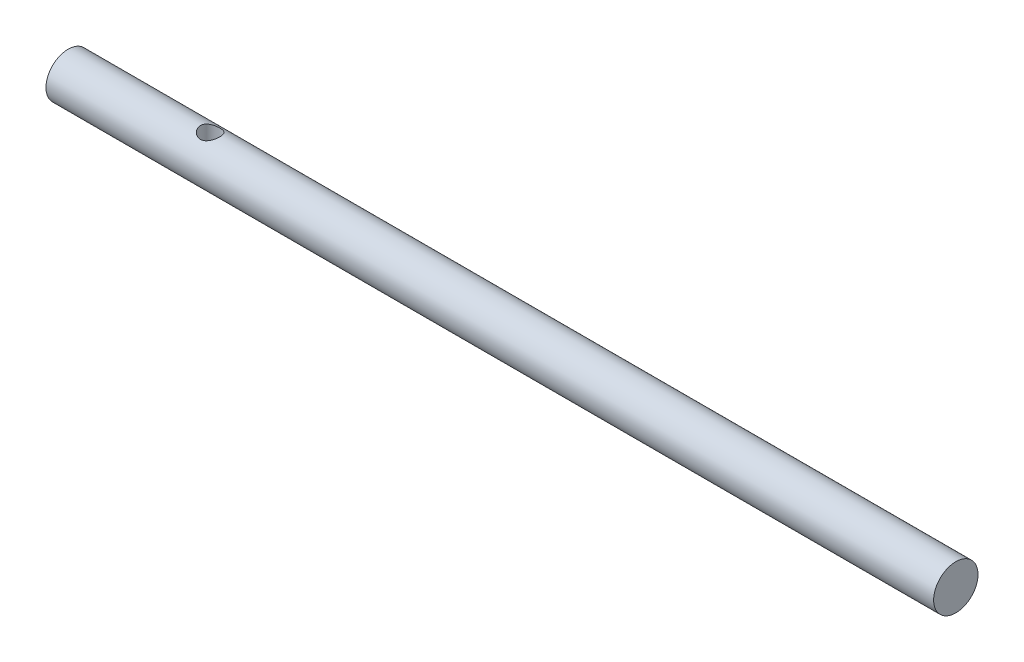
ISO-10303-21;
HEADER;
FILE_DESCRIPTION(('STEP AP214'),'2;1');
FILE_NAME('part.step','',(''),(''),'','','');
FILE_SCHEMA(('AUTOMOTIVE_DESIGN { 1 0 10303 214 1 1 1 1 }'));
ENDSEC;
DATA;
#1=APPLICATION_CONTEXT('core data for automotive mechanical design processes');
#2=APPLICATION_PROTOCOL_DEFINITION('international standard','automotive_design',2000,#1);
#3=PRODUCT_CONTEXT('',#1,'mechanical');
#4=PRODUCT('Part','Part','',(#3));
#5=PRODUCT_RELATED_PRODUCT_CATEGORY('part','',(#4));
#6=PRODUCT_DEFINITION_FORMATION('','',#4);
#7=PRODUCT_DEFINITION_CONTEXT('part definition',#1,'design');
#8=PRODUCT_DEFINITION('design','',#6,#7);
#9=PRODUCT_DEFINITION_SHAPE('','',#8);
#10=(LENGTH_UNIT() NAMED_UNIT(*) SI_UNIT(.MILLI.,.METRE.));
#11=(NAMED_UNIT(*) PLANE_ANGLE_UNIT() SI_UNIT($,.RADIAN.));
#12=(NAMED_UNIT(*) SI_UNIT($,.STERADIAN.) SOLID_ANGLE_UNIT());
#13=UNCERTAINTY_MEASURE_WITH_UNIT(LENGTH_MEASURE(1.E-05),#10,'distance_accuracy_value','');
#14=(GEOMETRIC_REPRESENTATION_CONTEXT(3) GLOBAL_UNCERTAINTY_ASSIGNED_CONTEXT((#13)) GLOBAL_UNIT_ASSIGNED_CONTEXT((#10,
#11,#12)) REPRESENTATION_CONTEXT('',''));
#15=CARTESIAN_POINT('',(0.,0.,0.));
#16=DIRECTION('',(0.,0.,1.));
#17=DIRECTION('',(1.,0.,0.));
#18=AXIS2_PLACEMENT_3D('',#15,#16,#17);
#19=CARTESIAN_POINT('',(50.,0.,0.));
#20=DIRECTION('',(-1.,0.,0.));
#21=DIRECTION('',(0.,0.,1.));
#22=AXIS2_PLACEMENT_3D('',#19,#20,#21);
#23=CYLINDRICAL_SURFACE('',#22,2.5);
#24=CARTESIAN_POINT('',(-34.,-2.24499443206436,1.1));
#25=CARTESIAN_POINT('',(-34.058325345306,-2.24500186891575,1.09999264071967));
#26=CARTESIAN_POINT('',(-34.116730956657,-2.2473008014463,1.09533182245849));
#27=CARTESIAN_POINT('',(-34.2318356309388,-2.2561976772502,1.07687935781384));
#28=CARTESIAN_POINT('',(-34.2885299236318,-2.26280665090222,1.06306428213531));
#29=CARTESIAN_POINT('',(-34.3983293844031,-2.27941479604708,1.02696546928902));
#30=CARTESIAN_POINT('',(-34.4514491385233,-2.28939904371374,1.00471896027897));
#31=CARTESIAN_POINT('',(-34.5531890817527,-2.31161149325762,0.952498974806722));
#32=CARTESIAN_POINT('',(-34.6018099751199,-2.32383934302118,0.922526710535585));
#33=CARTESIAN_POINT('',(-34.6965810830125,-2.35011094846474,0.853478204326697));
#34=CARTESIAN_POINT('',(-34.7423814102493,-2.36422061386325,0.813946593299061));
#35=CARTESIAN_POINT('',(-34.8269645463018,-2.39212743157456,0.727855362180888));
#36=CARTESIAN_POINT('',(-34.8657444616975,-2.40592445299291,0.68129285878561));
#37=CARTESIAN_POINT('',(-34.9370447262473,-2.43246847746696,0.579643227927889));
#38=CARTESIAN_POINT('',(-34.969161687624,-2.44513005272046,0.524248796898392));
#39=CARTESIAN_POINT('',(-35.0234668981569,-2.46715746778218,0.40818421649211));
#40=CARTESIAN_POINT('',(-35.0456600372448,-2.47652493026685,0.347516683060521));
#41=CARTESIAN_POINT('',(-35.078189214383,-2.49043942220434,0.226310849545852));
#42=CARTESIAN_POINT('',(-35.089131249575,-2.49523168581752,0.165963932126529));
#43=CARTESIAN_POINT('',(-35.1008156666043,-2.5003531145501,0.0441134537254076));
#44=CARTESIAN_POINT('',(-35.1015626953989,-2.50068431305423,-0.0173895674937717));
#45=CARTESIAN_POINT('',(-35.0931317480847,-2.49698346578356,-0.135361763608579));
#46=CARTESIAN_POINT('',(-35.0846225000889,-2.49324539438955,-0.191889766863553));
#47=CARTESIAN_POINT('',(-35.0590800076064,-2.48224055592851,-0.302619645234437));
#48=CARTESIAN_POINT('',(-35.042046132146,-2.47497352765724,-0.356821347840329));
#49=CARTESIAN_POINT('',(-34.9997508158519,-2.4574634692465,-0.462364843718379));
#50=CARTESIAN_POINT('',(-34.9743676767526,-2.44717667746158,-0.513650307195607));
#51=CARTESIAN_POINT('',(-34.9162227374928,-2.42461273867786,-0.611368753826881));
#52=CARTESIAN_POINT('',(-34.8834582563376,-2.41233486895003,-0.657799964862738));
#53=CARTESIAN_POINT('',(-34.8085446746648,-2.3858801337429,-0.748309969403557));
#54=CARTESIAN_POINT('',(-34.7658659371704,-2.37162983972768,-0.791929518202133));
#55=CARTESIAN_POINT('',(-34.6738052517502,-2.34352160386143,-0.871604932828491));
#56=CARTESIAN_POINT('',(-34.6244201136342,-2.32966385255521,-0.907657178035835));
#57=CARTESIAN_POINT('',(-34.5178669733776,-2.30334986356432,-0.972551863960962));
#58=CARTESIAN_POINT('',(-34.4604660589339,-2.29097226218579,-1.00104660738835));
#59=CARTESIAN_POINT('',(-34.3409936369972,-2.2699857105531,-1.0477731426051));
#60=CARTESIAN_POINT('',(-34.2789259582371,-2.26137370960231,-1.06601324561569));
#61=CARTESIAN_POINT('',(-34.1564963569089,-2.24967637482319,-1.09047181528063));
#62=CARTESIAN_POINT('',(-34.0963179921052,-2.24624709890656,-1.09744082962861));
#63=CARTESIAN_POINT('',(-33.9755667814109,-2.24431716581293,-1.10138444364863));
#64=CARTESIAN_POINT('',(-33.9149941110651,-2.24581444755476,-1.09836322284601));
#65=CARTESIAN_POINT('',(-33.7999744510811,-2.2532104139799,-1.08309883991271));
#66=CARTESIAN_POINT('',(-33.74540871177,-2.25877064140546,-1.07156417098469));
#67=CARTESIAN_POINT('',(-33.6390458926669,-2.27321525169579,-1.04056836908944));
#68=CARTESIAN_POINT('',(-33.5872495155618,-2.28210047369949,-1.0211052350816));
#69=CARTESIAN_POINT('',(-33.485315024106,-2.30267121517148,-0.973855802064505));
#70=CARTESIAN_POINT('',(-33.4353527815072,-2.31446359544008,-0.945738180525623));
#71=CARTESIAN_POINT('',(-33.3405989711233,-2.33938364186295,-0.882295159103685));
#72=CARTESIAN_POINT('',(-33.2958098227297,-2.35251192744771,-0.846966407868076));
#73=CARTESIAN_POINT('',(-33.2083434832694,-2.38009237517463,-0.766250940130199));
#74=CARTESIAN_POINT('',(-33.1662473538417,-2.39455440317886,-0.72023530679972));
#75=CARTESIAN_POINT('',(-33.0902491891778,-2.42206311373892,-0.6214784090896));
#76=CARTESIAN_POINT('',(-33.0563482123507,-2.43510961335855,-0.568736277320662));
#77=CARTESIAN_POINT('',(-32.9975812463636,-2.45847705567111,-0.457328840448403));
#78=CARTESIAN_POINT('',(-32.972784635954,-2.46877691176735,-0.398622234619686));
#79=CARTESIAN_POINT('',(-32.9336214892805,-2.48532596548122,-0.277295435121201));
#80=CARTESIAN_POINT('',(-32.9192479512683,-2.49157788201844,-0.214677899404991));
#81=CARTESIAN_POINT('',(-32.9022927377935,-2.49898163891922,-0.0924681222925638));
#82=CARTESIAN_POINT('',(-32.8988945431405,-2.50048642500148,-0.0330099164450921));
#83=CARTESIAN_POINT('',(-32.9017346743372,-2.49923675127029,0.0856232403929734));
#84=CARTESIAN_POINT('',(-32.9079709447969,-2.49648319991867,0.144798249098671));
#85=CARTESIAN_POINT('',(-32.9293191791134,-2.48722160837499,0.258552884051371));
#86=CARTESIAN_POINT('',(-32.9440392317527,-2.48087956206805,0.313220762920484));
#87=CARTESIAN_POINT('',(-32.9814842492948,-2.46517470655145,0.419273041124577));
#88=CARTESIAN_POINT('',(-33.0042106383491,-2.45581135994377,0.470656854374067));
#89=CARTESIAN_POINT('',(-33.0581723526588,-2.43441956507932,0.571286976441052));
#90=CARTESIAN_POINT('',(-33.0897498381188,-2.42228866159088,0.620327472114028));
#91=CARTESIAN_POINT('',(-33.1600420188752,-2.39675984874361,0.712628438098105));
#92=CARTESIAN_POINT('',(-33.1987596837198,-2.38336141336083,0.755886490574639));
#93=CARTESIAN_POINT('',(-33.28573536284,-2.35549351893128,0.838875102840794));
#94=CARTESIAN_POINT('',(-33.3344986267506,-2.34102108586692,0.878076999318054));
#95=CARTESIAN_POINT('',(-33.4383134657132,-2.31365292914796,0.947850118274255));
#96=CARTESIAN_POINT('',(-33.4933688556396,-2.30075817194161,0.978416065426929));
#97=CARTESIAN_POINT('',(-33.6085846143773,-2.27815955688964,1.02994457246076));
#98=CARTESIAN_POINT('',(-33.6687557387487,-2.26846264199146,1.05088627507499));
#99=CARTESIAN_POINT('',(-33.7922346237686,-2.25376370647696,1.08206209910023));
#100=CARTESIAN_POINT('',(-33.8555311039897,-2.24874593942601,1.09233214658097));
#101=CARTESIAN_POINT('',(-33.9461016327264,-2.24547707915797,1.09901270586322));
#102=CARTESIAN_POINT('',(-33.9730422429305,-2.24499099477939,1.10000340143192));
#103=CARTESIAN_POINT('',(-34.,-2.24499443206436,1.1));
#104=B_SPLINE_CURVE_WITH_KNOTS('',3,(#24,#25,#26,#27,#28,#29,#30,#31,#32,#33,#34,#35,#36,#37,
#38,#39,#40,#41,#42,#43,#44,#45,#46,#47,#48,#49,#50,#51,#52,#53,#54,#55,#56,#57,#58,#59,#60,#61,
#62,#63,#64,#65,#66,#67,#68,#69,#70,#71,#72,#73,#74,#75,#76,#77,#78,#79,#80,#81,#82,#83,#84,#85,
#86,#87,#88,#89,#90,#91,#92,#93,#94,#95,#96,#97,#98,#99,#100,#101,#102,#103),.UNSPECIFIED.,.T.,
.F.,(4,2,2,2,2,2,2,2,2,2,2,2,2,2,2,2,2,2,2,2,2,2,2,2,2,2,2,2,2,2,2,2,2,2,2,2,2,2,2,4),(0.,
0.174891994667569,0.350233343674115,0.52480934344009,0.699357968434034,0.884928681651842,
1.07057570344714,1.26538500767086,1.46009821416858,1.64366581372381,1.82714973904772,
1.99820752306006,2.16927797025682,2.34296144404576,2.51670810381826,2.70388470367641,
2.89115065615066,3.08593731227327,3.28056586850661,3.46160310705005,3.64256461624718,
3.80995675730999,3.97739117215505,4.15226330196228,4.32721688891381,4.51839534153398,
4.70959847179733,4.90222980302484,5.09473161306756,5.27253594053547,5.45030234095708,
5.62044885932698,5.79062565831862,5.96859980397144,6.14664813538063,6.33841613542973,
6.53030102619199,6.72259982346398,6.91424912960409,6.99508355726003),.UNSPECIFIED.);
#105=CARTESIAN_POINT('',(-34.,-2.24499443206436,1.1));
#106=VERTEX_POINT('',#105);
#107=EDGE_CURVE('E41',#106,#106,#104,.T.);
#108=ORIENTED_EDGE('',*,*,#107,.F.);
#109=EDGE_LOOP('',(#108));
#110=FACE_BOUND('',#109,.T.);
#111=CARTESIAN_POINT('',(-34.,2.24499443206436,1.1));
#112=CARTESIAN_POINT('',(-33.941674654694,2.24500186891575,1.09999264071967));
#113=CARTESIAN_POINT('',(-33.883269043343,2.2473008014463,1.09533182245849));
#114=CARTESIAN_POINT('',(-33.7681643690612,2.2561976772502,1.07687935781384));
#115=CARTESIAN_POINT('',(-33.7114700763682,2.26280665090222,1.06306428213531));
#116=CARTESIAN_POINT('',(-33.6016706155969,2.27941479604708,1.02696546928902));
#117=CARTESIAN_POINT('',(-33.5485508614767,2.28939904371374,1.00471896027897));
#118=CARTESIAN_POINT('',(-33.4468109182473,2.31161149325762,0.952498974806722));
#119=CARTESIAN_POINT('',(-33.3981900248801,2.32383934302118,0.922526710535585));
#120=CARTESIAN_POINT('',(-33.3034189169875,2.35011094846474,0.853478204326697));
#121=CARTESIAN_POINT('',(-33.2576185897507,2.36422061386325,0.813946593299061));
#122=CARTESIAN_POINT('',(-33.1730354536982,2.39212743157456,0.727855362180888));
#123=CARTESIAN_POINT('',(-33.1342555383025,2.40592445299291,0.681292858785611));
#124=CARTESIAN_POINT('',(-33.0629552737527,2.43246847746696,0.579643227927887));
#125=CARTESIAN_POINT('',(-33.030838312376,2.44513005272046,0.524248796898386));
#126=CARTESIAN_POINT('',(-32.9765331018431,2.46715746778218,0.408184216492105));
#127=CARTESIAN_POINT('',(-32.9543399627552,2.47652493026685,0.347516683060518));
#128=CARTESIAN_POINT('',(-32.921810785617,2.49043942220434,0.226310849545852));
#129=CARTESIAN_POINT('',(-32.910868750425,2.49523168581752,0.165963932126529));
#130=CARTESIAN_POINT('',(-32.8991843333957,2.5003531145501,0.0441134537254075));
#131=CARTESIAN_POINT('',(-32.8984373046011,2.50068431305423,-0.0173895674937717));
#132=CARTESIAN_POINT('',(-32.9068682519153,2.49698346578356,-0.135361763608579));
#133=CARTESIAN_POINT('',(-32.9153774999111,2.49324539438955,-0.191889766863553));
#134=CARTESIAN_POINT('',(-32.9409199923936,2.48224055592851,-0.302619645234437));
#135=CARTESIAN_POINT('',(-32.957953867854,2.47497352765724,-0.356821347840329));
#136=CARTESIAN_POINT('',(-33.0002491841481,2.4574634692465,-0.462364843718379));
#137=CARTESIAN_POINT('',(-33.0256323232474,2.44717667746158,-0.513650307195607));
#138=CARTESIAN_POINT('',(-33.0837772625072,2.42461273867786,-0.611368753826881));
#139=CARTESIAN_POINT('',(-33.1165417436624,2.41233486895003,-0.657799964862738));
#140=CARTESIAN_POINT('',(-33.1914553253352,2.3858801337429,-0.748309969403557));
#141=CARTESIAN_POINT('',(-33.2341340628296,2.37162983972768,-0.791929518202133));
#142=CARTESIAN_POINT('',(-33.3261947482498,2.34352160386143,-0.871604932828491));
#143=CARTESIAN_POINT('',(-33.3755798863658,2.32966385255521,-0.907657178035835));
#144=CARTESIAN_POINT('',(-33.4821330266224,2.30334986356432,-0.972551863960962));
#145=CARTESIAN_POINT('',(-33.5395339410661,2.29097226218579,-1.00104660738835));
#146=CARTESIAN_POINT('',(-33.6590063630028,2.2699857105531,-1.0477731426051));
#147=CARTESIAN_POINT('',(-33.7210740417629,2.26137370960231,-1.06601324561569));
#148=CARTESIAN_POINT('',(-33.8435036430911,2.24967637482319,-1.09047181528063));
#149=CARTESIAN_POINT('',(-33.9036820078948,2.24624709890656,-1.09744082962861));
#150=CARTESIAN_POINT('',(-34.0244332185891,2.24431716581293,-1.10138444364863));
#151=CARTESIAN_POINT('',(-34.0850058889349,2.24581444755476,-1.09836322284601));
#152=CARTESIAN_POINT('',(-34.2000255489189,2.2532104139799,-1.08309883991271));
#153=CARTESIAN_POINT('',(-34.25459128823,2.25877064140546,-1.07156417098469));
#154=CARTESIAN_POINT('',(-34.3609541073331,2.27321525169579,-1.04056836908944));
#155=CARTESIAN_POINT('',(-34.4127504844382,2.28210047369949,-1.0211052350816));
#156=CARTESIAN_POINT('',(-34.514684975894,2.30267121517148,-0.973855802064505));
#157=CARTESIAN_POINT('',(-34.5646472184928,2.31446359544008,-0.945738180525623));
#158=CARTESIAN_POINT('',(-34.6594010288767,2.33938364186295,-0.882295159103685));
#159=CARTESIAN_POINT('',(-34.7041901772703,2.35251192744771,-0.846966407868076));
#160=CARTESIAN_POINT('',(-34.7916565167306,2.38009237517463,-0.766250940130199));
#161=CARTESIAN_POINT('',(-34.8337526461583,2.39455440317886,-0.72023530679972));
#162=CARTESIAN_POINT('',(-34.9097508108222,2.42206311373892,-0.6214784090896));
#163=CARTESIAN_POINT('',(-34.9436517876493,2.43510961335855,-0.568736277320662));
#164=CARTESIAN_POINT('',(-35.0024187536364,2.45847705567111,-0.457328840448403));
#165=CARTESIAN_POINT('',(-35.027215364046,2.46877691176735,-0.398622234619686));
#166=CARTESIAN_POINT('',(-35.0663785107195,2.48532596548122,-0.277295435121201));
#167=CARTESIAN_POINT('',(-35.0807520487317,2.49157788201844,-0.214677899404991));
#168=CARTESIAN_POINT('',(-35.0977072622065,2.49898163891922,-0.0924681222925638));
#169=CARTESIAN_POINT('',(-35.1011054568595,2.50048642500148,-0.0330099164450921));
#170=CARTESIAN_POINT('',(-35.0982653256628,2.49923675127029,0.0856232403929734));
#171=CARTESIAN_POINT('',(-35.0920290552031,2.49648319991867,0.144798249098671));
#172=CARTESIAN_POINT('',(-35.0706808208866,2.48722160837499,0.25855288405137));
#173=CARTESIAN_POINT('',(-35.0559607682473,2.48087956206805,0.313220762920482));
#174=CARTESIAN_POINT('',(-35.0185157507052,2.46517470655145,0.419273041124576));
#175=CARTESIAN_POINT('',(-34.9957893616509,2.45581135994377,0.470656854374066));
#176=CARTESIAN_POINT('',(-34.9418276473412,2.43441956507932,0.571286976441052));
#177=CARTESIAN_POINT('',(-34.9102501618812,2.42228866159088,0.620327472114028));
#178=CARTESIAN_POINT('',(-34.8399579811249,2.39675984874361,0.712628438098105));
#179=CARTESIAN_POINT('',(-34.8012403162802,2.38336141336083,0.755886490574638));
#180=CARTESIAN_POINT('',(-34.71426463716,2.35549351893128,0.838875102840796));
#181=CARTESIAN_POINT('',(-34.6655013732495,2.34102108586691,0.878076999318059));
#182=CARTESIAN_POINT('',(-34.5616865342868,2.31365292914796,0.947850118274259));
#183=CARTESIAN_POINT('',(-34.5066311443604,2.30075817194161,0.978416065426931));
#184=CARTESIAN_POINT('',(-34.3914153856227,2.27815955688964,1.02994457246076));
#185=CARTESIAN_POINT('',(-34.3312442612513,2.26846264199146,1.05088627507499));
#186=CARTESIAN_POINT('',(-34.2077653762314,2.25376370647696,1.08206209910023));
#187=CARTESIAN_POINT('',(-34.1444688960103,2.24874593942601,1.09233214658097));
#188=CARTESIAN_POINT('',(-34.0538983672736,2.24547707915797,1.09901270586322));
#189=CARTESIAN_POINT('',(-34.0269577570695,2.24499099477939,1.10000340143192));
#190=CARTESIAN_POINT('',(-34.,2.24499443206436,1.1));
#191=B_SPLINE_CURVE_WITH_KNOTS('',3,(#111,#112,#113,#114,#115,#116,#117,#118,#119,#120,#121,
#122,#123,#124,#125,#126,#127,#128,#129,#130,#131,#132,#133,#134,#135,#136,#137,#138,#139,#140,
#141,#142,#143,#144,#145,#146,#147,#148,#149,#150,#151,#152,#153,#154,#155,#156,#157,#158,#159,
#160,#161,#162,#163,#164,#165,#166,#167,#168,#169,#170,#171,#172,#173,#174,#175,#176,#177,#178,
#179,#180,#181,#182,#183,#184,#185,#186,#187,#188,#189,#190),.UNSPECIFIED.,.T.,.F.,(4,2,2,2,2,2,
2,2,2,2,2,2,2,2,2,2,2,2,2,2,2,2,2,2,2,2,2,2,2,2,2,2,2,2,2,2,2,2,2,4),(0.,0.174891994667569,
0.350233343674115,0.52480934344009,0.699357968434034,0.884928681651842,1.07057570344714,
1.26538500767087,1.46009821416858,1.64366581372381,1.82714973904772,1.99820752306005,
2.16927797025682,2.34296144404576,2.51670810381826,2.70388470367641,2.89115065615066,
3.08593731227327,3.28056586850661,3.46160310705005,3.64256461624718,3.80995675730999,
3.97739117215505,4.15226330196228,4.32721688891381,4.51839534153398,4.70959847179733,
4.90222980302484,5.09473161306756,5.27253594053547,5.45030234095708,5.62044885932698,
5.79062565831862,5.96859980397144,6.14664813538063,6.33841613542974,6.53030102619199,
6.72259982346398,6.9142491296041,6.99508355726003),.UNSPECIFIED.);
#192=CARTESIAN_POINT('',(-34.,2.24499443206436,1.1));
#193=VERTEX_POINT('',#192);
#194=EDGE_CURVE('E49',#193,#193,#191,.T.);
#195=ORIENTED_EDGE('',*,*,#194,.F.);
#196=EDGE_LOOP('',(#195));
#197=FACE_BOUND('',#196,.T.);
#198=CARTESIAN_POINT('',(50.,0.,0.));
#199=DIRECTION('',(1.,0.,0.));
#200=DIRECTION('',(0.,0.,-1.));
#201=AXIS2_PLACEMENT_3D('',#198,#199,#200);
#202=CIRCLE('',#201,2.5);
#203=CARTESIAN_POINT('',(50.,0.,-2.5));
#204=VERTEX_POINT('',#203);
#205=EDGE_CURVE('E10',#204,#204,#202,.T.);
#206=ORIENTED_EDGE('',*,*,#205,.F.);
#207=EDGE_LOOP('',(#206));
#208=FACE_BOUND('',#207,.T.);
#209=CARTESIAN_POINT('',(-50.,0.,0.));
#210=DIRECTION('',(1.,0.,0.));
#211=DIRECTION('',(0.,0.,-1.));
#212=AXIS2_PLACEMENT_3D('',#209,#210,#211);
#213=CIRCLE('',#212,2.5);
#214=CARTESIAN_POINT('',(-50.,0.,-2.5));
#215=VERTEX_POINT('',#214);
#216=EDGE_CURVE('E34',#215,#215,#213,.T.);
#217=ORIENTED_EDGE('',*,*,#216,.T.);
#218=EDGE_LOOP('',(#217));
#219=FACE_BOUND('',#218,.T.);
#220=ADVANCED_FACE('F31',(#110,#197,#208,#219),#23,.T.);
#221=CARTESIAN_POINT('',(50.,0.,0.));
#222=DIRECTION('',(1.,0.,0.));
#223=DIRECTION('',(0.,0.,-1.));
#224=AXIS2_PLACEMENT_3D('',#221,#222,#223);
#225=PLANE('',#224);
#226=ORIENTED_EDGE('',*,*,#205,.T.);
#227=EDGE_LOOP('',(#226));
#228=FACE_BOUND('',#227,.T.);
#229=ADVANCED_FACE('F60',(#228),#225,.T.);
#230=CARTESIAN_POINT('',(-50.,0.,0.));
#231=DIRECTION('',(1.,0.,0.));
#232=DIRECTION('',(0.,0.,-1.));
#233=AXIS2_PLACEMENT_3D('',#230,#231,#232);
#234=PLANE('',#233);
#235=ORIENTED_EDGE('',*,*,#216,.F.);
#236=EDGE_LOOP('',(#235));
#237=FACE_BOUND('',#236,.T.);
#238=ADVANCED_FACE('F58',(#237),#234,.F.);
#239=CARTESIAN_POINT('',(-34.,-2.501,0.));
#240=DIRECTION('',(0.,1.,0.));
#241=DIRECTION('',(0.,0.,1.));
#242=AXIS2_PLACEMENT_3D('',#239,#240,#241);
#243=CYLINDRICAL_SURFACE('',#242,1.1);
#244=ORIENTED_EDGE('',*,*,#194,.T.);
#245=EDGE_LOOP('',(#244));
#246=FACE_BOUND('',#245,.T.);
#247=ORIENTED_EDGE('',*,*,#107,.T.);
#248=EDGE_LOOP('',(#247));
#249=FACE_BOUND('',#248,.T.);
#250=ADVANCED_FACE('F52',(#246,#249),#243,.F.);
#251=CLOSED_SHELL('',(#220,#229,#238,#250));
#252=MANIFOLD_SOLID_BREP('B2',#251);
#253=ADVANCED_BREP_SHAPE_REPRESENTATION('',(#18,#252),#14);
#254=SHAPE_DEFINITION_REPRESENTATION(#9,#253);
ENDSEC;
END-ISO-10303-21;
